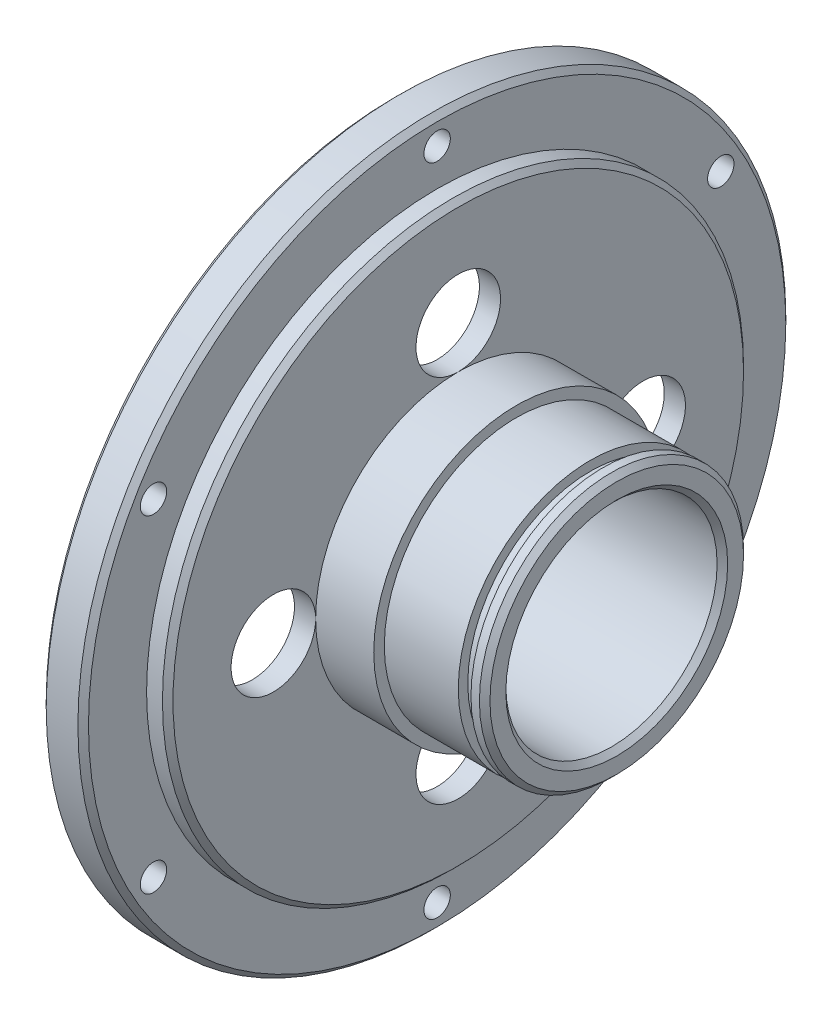
ISO-10303-21;
HEADER;
FILE_DESCRIPTION(('STEP AP214'),'2;1');
FILE_NAME('part.step','',(''),(''),'','','');
FILE_SCHEMA(('AUTOMOTIVE_DESIGN { 1 0 10303 214 1 1 1 1 }'));
ENDSEC;
DATA;
#1=APPLICATION_CONTEXT('core data for automotive mechanical design processes');
#2=APPLICATION_PROTOCOL_DEFINITION('international standard','automotive_design',2000,#1);
#3=PRODUCT_CONTEXT('',#1,'mechanical');
#4=PRODUCT('Part','Part','',(#3));
#5=PRODUCT_RELATED_PRODUCT_CATEGORY('part','',(#4));
#6=PRODUCT_DEFINITION_FORMATION('','',#4);
#7=PRODUCT_DEFINITION_CONTEXT('part definition',#1,'design');
#8=PRODUCT_DEFINITION('design','',#6,#7);
#9=PRODUCT_DEFINITION_SHAPE('','',#8);
#10=(LENGTH_UNIT() NAMED_UNIT(*) SI_UNIT(.MILLI.,.METRE.));
#11=(NAMED_UNIT(*) PLANE_ANGLE_UNIT() SI_UNIT($,.RADIAN.));
#12=(NAMED_UNIT(*) SI_UNIT($,.STERADIAN.) SOLID_ANGLE_UNIT());
#13=UNCERTAINTY_MEASURE_WITH_UNIT(LENGTH_MEASURE(1.E-05),#10,'distance_accuracy_value','');
#14=(GEOMETRIC_REPRESENTATION_CONTEXT(3) GLOBAL_UNCERTAINTY_ASSIGNED_CONTEXT((#13)) GLOBAL_UNIT_ASSIGNED_CONTEXT((#10,
#11,#12)) REPRESENTATION_CONTEXT('',''));
#15=CARTESIAN_POINT('',(0.,0.,0.));
#16=DIRECTION('',(0.,0.,1.));
#17=DIRECTION('',(1.,0.,0.));
#18=AXIS2_PLACEMENT_3D('',#15,#16,#17);
#19=CARTESIAN_POINT('',(0.,0.,0.));
#20=DIRECTION('',(-1.,0.,0.));
#21=DIRECTION('',(0.,0.,1.));
#22=AXIS2_PLACEMENT_3D('',#19,#20,#21);
#23=PLANE('',#22);
#24=CARTESIAN_POINT('',(0.,15.5000000000003,26.8467875173174));
#25=DIRECTION('',(1.,0.,0.));
#26=DIRECTION('',(0.,0.,-1.));
#27=AXIS2_PLACEMENT_3D('',#24,#25,#26);
#28=CIRCLE('',#27,1.25);
#29=CARTESIAN_POINT('',(0.,15.5000000000003,25.5967875173174));
#30=VERTEX_POINT('',#29);
#31=EDGE_CURVE('E261',#30,#30,#28,.T.);
#32=ORIENTED_EDGE('',*,*,#31,.T.);
#33=EDGE_LOOP('',(#32));
#34=FACE_BOUND('',#33,.T.);
#35=CARTESIAN_POINT('',(0.,0.,0.));
#36=DIRECTION('',(-1.,0.,0.));
#37=DIRECTION('',(0.,0.,1.));
#38=AXIS2_PLACEMENT_3D('',#35,#36,#37);
#39=CIRCLE('',#38,33.);
#40=CARTESIAN_POINT('',(0.,0.,33.));
#41=VERTEX_POINT('',#40);
#42=EDGE_CURVE('E177',#41,#41,#39,.T.);
#43=ORIENTED_EDGE('',*,*,#42,.T.);
#44=EDGE_LOOP('',(#43));
#45=FACE_BOUND('',#44,.T.);
#46=CARTESIAN_POINT('',(0.,0.,0.));
#47=DIRECTION('',(-1.,0.,0.));
#48=DIRECTION('',(0.,0.,1.));
#49=AXIS2_PLACEMENT_3D('',#46,#47,#48);
#50=CIRCLE('',#49,26.000000000003);
#51=CARTESIAN_POINT('',(0.,0.,26.000000000003));
#52=VERTEX_POINT('',#51);
#53=EDGE_CURVE('E181',#52,#52,#50,.F.);
#54=ORIENTED_EDGE('',*,*,#53,.T.);
#55=EDGE_LOOP('',(#54));
#56=FACE_BOUND('',#55,.T.);
#57=CARTESIAN_POINT('',(0.,31.,0.));
#58=DIRECTION('',(1.,0.,0.));
#59=DIRECTION('',(0.,0.,-1.));
#60=AXIS2_PLACEMENT_3D('',#57,#58,#59);
#61=CIRCLE('',#60,1.25);
#62=CARTESIAN_POINT('',(0.,31.,-1.25));
#63=VERTEX_POINT('',#62);
#64=EDGE_CURVE('E207',#63,#63,#61,.T.);
#65=ORIENTED_EDGE('',*,*,#64,.T.);
#66=EDGE_LOOP('',(#65));
#67=FACE_BOUND('',#66,.T.);
#68=CARTESIAN_POINT('',(0.,15.4999999999999,-26.8467875173176));
#69=DIRECTION('',(1.,0.,0.));
#70=DIRECTION('',(0.,0.,-1.));
#71=AXIS2_PLACEMENT_3D('',#68,#69,#70);
#72=CIRCLE('',#71,1.25);
#73=CARTESIAN_POINT('',(0.,15.4999999999999,-28.0967875173176));
#74=VERTEX_POINT('',#73);
#75=EDGE_CURVE('E229',#74,#74,#72,.T.);
#76=ORIENTED_EDGE('',*,*,#75,.T.);
#77=EDGE_LOOP('',(#76));
#78=FACE_BOUND('',#77,.T.);
#79=CARTESIAN_POINT('',(0.,-15.5000000000001,-26.8467875173175));
#80=DIRECTION('',(1.,0.,0.));
#81=DIRECTION('',(0.,0.,-1.));
#82=AXIS2_PLACEMENT_3D('',#79,#80,#81);
#83=CIRCLE('',#82,1.25);
#84=CARTESIAN_POINT('',(0.,-15.5000000000001,-28.0967875173175));
#85=VERTEX_POINT('',#84);
#86=EDGE_CURVE('E237',#85,#85,#83,.T.);
#87=ORIENTED_EDGE('',*,*,#86,.T.);
#88=EDGE_LOOP('',(#87));
#89=FACE_BOUND('',#88,.T.);
#90=CARTESIAN_POINT('',(0.,-31.,0.));
#91=DIRECTION('',(1.,0.,0.));
#92=DIRECTION('',(0.,0.,-1.));
#93=AXIS2_PLACEMENT_3D('',#90,#91,#92);
#94=CIRCLE('',#93,1.25);
#95=CARTESIAN_POINT('',(0.,-31.,-1.25));
#96=VERTEX_POINT('',#95);
#97=EDGE_CURVE('E245',#96,#96,#94,.T.);
#98=ORIENTED_EDGE('',*,*,#97,.T.);
#99=EDGE_LOOP('',(#98));
#100=FACE_BOUND('',#99,.T.);
#101=CARTESIAN_POINT('',(0.,-15.4999999999997,26.8467875173177));
#102=DIRECTION('',(1.,0.,0.));
#103=DIRECTION('',(0.,0.,-1.));
#104=AXIS2_PLACEMENT_3D('',#101,#102,#103);
#105=CIRCLE('',#104,1.25);
#106=CARTESIAN_POINT('',(0.,-15.4999999999997,25.5967875173177));
#107=VERTEX_POINT('',#106);
#108=EDGE_CURVE('E253',#107,#107,#105,.T.);
#109=ORIENTED_EDGE('',*,*,#108,.T.);
#110=EDGE_LOOP('',(#109));
#111=FACE_BOUND('',#110,.T.);
#112=ADVANCED_FACE('F53',(#34,#45,#56,#67,#78,#89,#100,#111),#23,.T.);
#113=CARTESIAN_POINT('',(0.,0.,0.));
#114=DIRECTION('',(-1.,0.,0.));
#115=DIRECTION('',(0.,0.,1.));
#116=AXIS2_PLACEMENT_3D('',#113,#114,#115);
#117=CYLINDRICAL_SURFACE('',#116,12.5);
#118=CARTESIAN_POINT('',(20.5,0.,0.));
#119=DIRECTION('',(1.,0.,0.));
#120=DIRECTION('',(0.,0.,-1.));
#121=AXIS2_PLACEMENT_3D('',#118,#119,#120);
#122=CIRCLE('',#121,12.5);
#123=CARTESIAN_POINT('',(20.5,0.,-12.5));
#124=VERTEX_POINT('',#123);
#125=EDGE_CURVE('E185',#124,#124,#122,.F.);
#126=ORIENTED_EDGE('',*,*,#125,.T.);
#127=EDGE_LOOP('',(#126));
#128=FACE_BOUND('',#127,.T.);
#129=CARTESIAN_POINT('',(19.7,0.,0.));
#130=DIRECTION('',(-1.,0.,0.));
#131=DIRECTION('',(0.,0.,1.));
#132=AXIS2_PLACEMENT_3D('',#129,#130,#131);
#133=CIRCLE('',#132,12.5);
#134=CARTESIAN_POINT('',(19.7,0.,12.5));
#135=VERTEX_POINT('',#134);
#136=EDGE_CURVE('E149',#135,#135,#133,.T.);
#137=ORIENTED_EDGE('',*,*,#136,.F.);
#138=EDGE_LOOP('',(#137));
#139=FACE_BOUND('',#138,.T.);
#140=ADVANCED_FACE('F305',(#128,#139),#117,.T.);
#141=CARTESIAN_POINT('',(19.7,0.,0.));
#142=DIRECTION('',(1.,0.,0.));
#143=DIRECTION('',(0.,0.,-1.));
#144=AXIS2_PLACEMENT_3D('',#141,#142,#143);
#145=PLANE('',#144);
#146=CARTESIAN_POINT('',(19.7,0.,0.));
#147=DIRECTION('',(-1.,0.,0.));
#148=DIRECTION('',(0.,0.,1.));
#149=AXIS2_PLACEMENT_3D('',#146,#147,#148);
#150=CIRCLE('',#149,11.6);
#151=CARTESIAN_POINT('',(19.7,0.,11.6));
#152=VERTEX_POINT('',#151);
#153=EDGE_CURVE('E145',#152,#152,#150,.T.);
#154=ORIENTED_EDGE('',*,*,#153,.F.);
#155=EDGE_LOOP('',(#154));
#156=FACE_BOUND('',#155,.T.);
#157=ORIENTED_EDGE('',*,*,#136,.T.);
#158=EDGE_LOOP('',(#157));
#159=FACE_BOUND('',#158,.T.);
#160=ADVANCED_FACE('F311',(#156,#159),#145,.F.);
#161=CARTESIAN_POINT('',(0.,0.,0.));
#162=DIRECTION('',(-1.,0.,0.));
#163=DIRECTION('',(0.,0.,1.));
#164=AXIS2_PLACEMENT_3D('',#161,#162,#163);
#165=CYLINDRICAL_SURFACE('',#164,11.6);
#166=ORIENTED_EDGE('',*,*,#153,.T.);
#167=EDGE_LOOP('',(#166));
#168=FACE_BOUND('',#167,.T.);
#169=CARTESIAN_POINT('',(18.5,0.,0.));
#170=DIRECTION('',(-1.,0.,0.));
#171=DIRECTION('',(0.,0.,1.));
#172=AXIS2_PLACEMENT_3D('',#169,#170,#171);
#173=CIRCLE('',#172,11.6);
#174=CARTESIAN_POINT('',(18.5,0.,11.6));
#175=VERTEX_POINT('',#174);
#176=EDGE_CURVE('E141',#175,#175,#173,.T.);
#177=ORIENTED_EDGE('',*,*,#176,.F.);
#178=EDGE_LOOP('',(#177));
#179=FACE_BOUND('',#178,.T.);
#180=ADVANCED_FACE('F385',(#168,#179),#165,.T.);
#181=CARTESIAN_POINT('',(18.5,0.,0.));
#182=DIRECTION('',(1.,0.,0.));
#183=DIRECTION('',(0.,0.,-1.));
#184=AXIS2_PLACEMENT_3D('',#181,#182,#183);
#185=PLANE('',#184);
#186=ORIENTED_EDGE('',*,*,#176,.T.);
#187=EDGE_LOOP('',(#186));
#188=FACE_BOUND('',#187,.T.);
#189=CARTESIAN_POINT('',(18.5,0.,0.));
#190=DIRECTION('',(-1.,0.,0.));
#191=DIRECTION('',(0.,0.,1.));
#192=AXIS2_PLACEMENT_3D('',#189,#190,#191);
#193=CIRCLE('',#192,12.5);
#194=CARTESIAN_POINT('',(18.5,0.,12.5));
#195=VERTEX_POINT('',#194);
#196=EDGE_CURVE('E137',#195,#195,#193,.T.);
#197=ORIENTED_EDGE('',*,*,#196,.F.);
#198=EDGE_LOOP('',(#197));
#199=FACE_BOUND('',#198,.T.);
#200=ADVANCED_FACE('F389',(#188,#199),#185,.T.);
#201=ORIENTED_EDGE('',*,*,#196,.T.);
#202=EDGE_LOOP('',(#201));
#203=FACE_BOUND('',#202,.T.);
#204=CARTESIAN_POINT('',(11.5,0.,0.));
#205=DIRECTION('',(-1.,0.,0.));
#206=DIRECTION('',(0.,0.,1.));
#207=AXIS2_PLACEMENT_3D('',#204,#205,#206);
#208=CIRCLE('',#207,12.5);
#209=CARTESIAN_POINT('',(11.5,0.,12.5));
#210=VERTEX_POINT('',#209);
#211=EDGE_CURVE('E133',#210,#210,#208,.T.);
#212=ORIENTED_EDGE('',*,*,#211,.F.);
#213=EDGE_LOOP('',(#212));
#214=FACE_BOUND('',#213,.T.);
#215=ADVANCED_FACE('F314',(#203,#214),#117,.T.);
#216=CARTESIAN_POINT('',(11.5,0.,0.));
#217=DIRECTION('',(1.,0.,0.));
#218=DIRECTION('',(0.,0.,-1.));
#219=AXIS2_PLACEMENT_3D('',#216,#217,#218);
#220=PLANE('',#219);
#221=ORIENTED_EDGE('',*,*,#211,.T.);
#222=EDGE_LOOP('',(#221));
#223=FACE_BOUND('',#222,.T.);
#224=CARTESIAN_POINT('',(11.5,0.,0.));
#225=DIRECTION('',(-1.,0.,0.));
#226=DIRECTION('',(0.,0.,1.));
#227=AXIS2_PLACEMENT_3D('',#224,#225,#226);
#228=CIRCLE('',#227,13.5);
#229=CARTESIAN_POINT('',(11.5,0.,13.5));
#230=VERTEX_POINT('',#229);
#231=EDGE_CURVE('E128',#230,#230,#228,.T.);
#232=ORIENTED_EDGE('',*,*,#231,.F.);
#233=EDGE_LOOP('',(#232));
#234=FACE_BOUND('',#233,.T.);
#235=ADVANCED_FACE('F395',(#223,#234),#220,.T.);
#236=CARTESIAN_POINT('',(0.,0.,0.));
#237=DIRECTION('',(-1.,0.,0.));
#238=DIRECTION('',(0.,0.,1.));
#239=AXIS2_PLACEMENT_3D('',#236,#237,#238);
#240=CYLINDRICAL_SURFACE('',#239,13.5);
#241=ORIENTED_EDGE('',*,*,#231,.T.);
#242=EDGE_LOOP('',(#241));
#243=FACE_BOUND('',#242,.T.);
#244=CARTESIAN_POINT('',(6.,0.,0.));
#245=DIRECTION('',(-1.,0.,0.));
#246=DIRECTION('',(0.,0.,1.));
#247=AXIS2_PLACEMENT_3D('',#244,#245,#246);
#248=CIRCLE('',#247,13.5);
#249=CARTESIAN_POINT('',(6.,0.,13.5));
#250=VERTEX_POINT('',#249);
#251=CARTESIAN_POINT('',(6.,13.5,0.));
#252=VERTEX_POINT('',#251);
#253=EDGE_CURVE('E84',#250,#252,#248,.T.);
#254=ORIENTED_EDGE('',*,*,#253,.F.);
#255=CARTESIAN_POINT('',(6.,-13.5,0.));
#256=VERTEX_POINT('',#255);
#257=EDGE_CURVE('E94',#256,#250,#248,.T.);
#258=ORIENTED_EDGE('',*,*,#257,.F.);
#259=CARTESIAN_POINT('',(6.,1.41404994223147E-13,-13.5));
#260=VERTEX_POINT('',#259);
#261=EDGE_CURVE('E129',#260,#256,#248,.T.);
#262=ORIENTED_EDGE('',*,*,#261,.F.);
#263=EDGE_CURVE('E97',#252,#260,#248,.T.);
#264=ORIENTED_EDGE('',*,*,#263,.F.);
#265=EDGE_LOOP('',(#254,#258,#262,#264));
#266=FACE_BOUND('',#265,.T.);
#267=ADVANCED_FACE('F301',(#243,#266),#240,.T.);
#268=CARTESIAN_POINT('',(6.,0.,0.));
#269=DIRECTION('',(1.,0.,0.));
#270=DIRECTION('',(0.,0.,-1.));
#271=AXIS2_PLACEMENT_3D('',#268,#269,#270);
#272=PLANE('',#271);
#273=CARTESIAN_POINT('',(6.,0.,0.));
#274=DIRECTION('',(1.,0.,0.));
#275=DIRECTION('',(0.,0.,-1.));
#276=AXIS2_PLACEMENT_3D('',#273,#274,#275);
#277=CIRCLE('',#276,27.);
#278=CARTESIAN_POINT('',(6.,0.,-27.));
#279=VERTEX_POINT('',#278);
#280=EDGE_CURVE('E193',#279,#279,#277,.T.);
#281=ORIENTED_EDGE('',*,*,#280,.T.);
#282=EDGE_LOOP('',(#281));
#283=FACE_BOUND('',#282,.T.);
#284=ORIENTED_EDGE('',*,*,#257,.T.);
#285=CARTESIAN_POINT('',(6.,0.,17.5));
#286=DIRECTION('',(1.,0.,0.));
#287=DIRECTION('',(0.,0.,-1.));
#288=AXIS2_PLACEMENT_3D('',#285,#286,#287);
#289=CIRCLE('',#288,4.);
#290=EDGE_CURVE('E70',#250,#250,#289,.T.);
#291=ORIENTED_EDGE('',*,*,#290,.F.);
#292=ORIENTED_EDGE('',*,*,#253,.T.);
#293=CARTESIAN_POINT('',(6.,17.5,0.));
#294=DIRECTION('',(1.,0.,0.));
#295=DIRECTION('',(0.,0.,-1.));
#296=AXIS2_PLACEMENT_3D('',#293,#294,#295);
#297=CIRCLE('',#296,4.);
#298=EDGE_CURVE('E89',#252,#252,#297,.T.);
#299=ORIENTED_EDGE('',*,*,#298,.F.);
#300=ORIENTED_EDGE('',*,*,#263,.T.);
#301=CARTESIAN_POINT('',(6.,1.83302770289265E-13,-17.5));
#302=DIRECTION('',(1.,0.,0.));
#303=DIRECTION('',(0.,0.,-1.));
#304=AXIS2_PLACEMENT_3D('',#301,#302,#303);
#305=CIRCLE('',#304,4.);
#306=EDGE_CURVE('E206',#260,#260,#305,.T.);
#307=ORIENTED_EDGE('',*,*,#306,.F.);
#308=ORIENTED_EDGE('',*,*,#261,.T.);
#309=CARTESIAN_POINT('',(6.,-17.5,0.));
#310=DIRECTION('',(1.,0.,0.));
#311=DIRECTION('',(0.,0.,-1.));
#312=AXIS2_PLACEMENT_3D('',#309,#310,#311);
#313=CIRCLE('',#312,4.);
#314=EDGE_CURVE('E75',#256,#256,#313,.T.);
#315=ORIENTED_EDGE('',*,*,#314,.F.);
#316=EDGE_LOOP('',(#284,#291,#292,#299,#300,#307,#308,#315));
#317=FACE_BOUND('',#316,.T.);
#318=ADVANCED_FACE('F87',(#283,#317),#272,.T.);
#319=CARTESIAN_POINT('',(0.,0.,0.));
#320=DIRECTION('',(-1.,0.,0.));
#321=DIRECTION('',(0.,0.,1.));
#322=AXIS2_PLACEMENT_3D('',#319,#320,#321);
#323=CYLINDRICAL_SURFACE('',#322,27.5);
#324=CARTESIAN_POINT('',(5.5,0.,0.));
#325=DIRECTION('',(1.,0.,0.));
#326=DIRECTION('',(0.,0.,-1.));
#327=AXIS2_PLACEMENT_3D('',#324,#325,#326);
#328=CIRCLE('',#327,27.5);
#329=CARTESIAN_POINT('',(5.5,0.,-27.5));
#330=VERTEX_POINT('',#329);
#331=EDGE_CURVE('E189',#330,#330,#328,.F.);
#332=ORIENTED_EDGE('',*,*,#331,.T.);
#333=EDGE_LOOP('',(#332));
#334=FACE_BOUND('',#333,.T.);
#335=CARTESIAN_POINT('',(4.,0.,0.));
#336=DIRECTION('',(-1.,0.,0.));
#337=DIRECTION('',(0.,0.,1.));
#338=AXIS2_PLACEMENT_3D('',#335,#336,#337);
#339=CIRCLE('',#338,27.5);
#340=CARTESIAN_POINT('',(4.,0.,27.5));
#341=VERTEX_POINT('',#340);
#342=EDGE_CURVE('E95',#341,#341,#339,.T.);
#343=ORIENTED_EDGE('',*,*,#342,.F.);
#344=EDGE_LOOP('',(#343));
#345=FACE_BOUND('',#344,.T.);
#346=ADVANCED_FACE('F277',(#334,#345),#323,.T.);
#347=CARTESIAN_POINT('',(4.,0.,0.));
#348=DIRECTION('',(1.,0.,0.));
#349=DIRECTION('',(0.,0.,-1.));
#350=AXIS2_PLACEMENT_3D('',#347,#348,#349);
#351=PLANE('',#350);
#352=CARTESIAN_POINT('',(4.,15.5000000000003,26.8467875173174));
#353=DIRECTION('',(1.,0.,0.));
#354=DIRECTION('',(0.,0.,-1.));
#355=AXIS2_PLACEMENT_3D('',#352,#353,#354);
#356=CIRCLE('',#355,1.25);
#357=CARTESIAN_POINT('',(4.,15.5000000000003,25.5967875173174));
#358=VERTEX_POINT('',#357);
#359=EDGE_CURVE('E265',#358,#358,#356,.T.);
#360=ORIENTED_EDGE('',*,*,#359,.F.);
#361=EDGE_LOOP('',(#360));
#362=FACE_BOUND('',#361,.T.);
#363=CARTESIAN_POINT('',(4.,-15.4999999999997,26.8467875173177));
#364=DIRECTION('',(1.,0.,0.));
#365=DIRECTION('',(0.,0.,-1.));
#366=AXIS2_PLACEMENT_3D('',#363,#364,#365);
#367=CIRCLE('',#366,1.25);
#368=CARTESIAN_POINT('',(4.,-15.4999999999997,25.5967875173177));
#369=VERTEX_POINT('',#368);
#370=EDGE_CURVE('E257',#369,#369,#367,.T.);
#371=ORIENTED_EDGE('',*,*,#370,.F.);
#372=EDGE_LOOP('',(#371));
#373=FACE_BOUND('',#372,.T.);
#374=CARTESIAN_POINT('',(4.,-31.,0.));
#375=DIRECTION('',(1.,0.,0.));
#376=DIRECTION('',(0.,0.,-1.));
#377=AXIS2_PLACEMENT_3D('',#374,#375,#376);
#378=CIRCLE('',#377,1.25);
#379=CARTESIAN_POINT('',(4.,-31.,-1.25));
#380=VERTEX_POINT('',#379);
#381=EDGE_CURVE('E249',#380,#380,#378,.T.);
#382=ORIENTED_EDGE('',*,*,#381,.F.);
#383=EDGE_LOOP('',(#382));
#384=FACE_BOUND('',#383,.T.);
#385=CARTESIAN_POINT('',(4.,-15.5000000000001,-26.8467875173175));
#386=DIRECTION('',(1.,0.,0.));
#387=DIRECTION('',(0.,0.,-1.));
#388=AXIS2_PLACEMENT_3D('',#385,#386,#387);
#389=CIRCLE('',#388,1.25);
#390=CARTESIAN_POINT('',(4.,-15.5000000000001,-28.0967875173175));
#391=VERTEX_POINT('',#390);
#392=EDGE_CURVE('E241',#391,#391,#389,.T.);
#393=ORIENTED_EDGE('',*,*,#392,.F.);
#394=EDGE_LOOP('',(#393));
#395=FACE_BOUND('',#394,.T.);
#396=CARTESIAN_POINT('',(4.,15.4999999999999,-26.8467875173176));
#397=DIRECTION('',(1.,0.,0.));
#398=DIRECTION('',(0.,0.,-1.));
#399=AXIS2_PLACEMENT_3D('',#396,#397,#398);
#400=CIRCLE('',#399,1.25);
#401=CARTESIAN_POINT('',(4.,15.4999999999999,-28.0967875173176));
#402=VERTEX_POINT('',#401);
#403=EDGE_CURVE('E233',#402,#402,#400,.T.);
#404=ORIENTED_EDGE('',*,*,#403,.F.);
#405=EDGE_LOOP('',(#404));
#406=FACE_BOUND('',#405,.T.);
#407=CARTESIAN_POINT('',(4.,31.,0.));
#408=DIRECTION('',(1.,0.,0.));
#409=DIRECTION('',(0.,0.,-1.));
#410=AXIS2_PLACEMENT_3D('',#407,#408,#409);
#411=CIRCLE('',#410,1.25);
#412=CARTESIAN_POINT('',(4.,31.,-1.25));
#413=VERTEX_POINT('',#412);
#414=EDGE_CURVE('E225',#413,#413,#411,.T.);
#415=ORIENTED_EDGE('',*,*,#414,.F.);
#416=EDGE_LOOP('',(#415));
#417=FACE_BOUND('',#416,.T.);
#418=CARTESIAN_POINT('',(4.,0.,0.));
#419=DIRECTION('',(1.,0.,0.));
#420=DIRECTION('',(0.,0.,-1.));
#421=AXIS2_PLACEMENT_3D('',#418,#419,#420);
#422=CIRCLE('',#421,33.);
#423=CARTESIAN_POINT('',(4.,0.,-33.));
#424=VERTEX_POINT('',#423);
#425=EDGE_CURVE('E11',#424,#424,#422,.T.);
#426=ORIENTED_EDGE('',*,*,#425,.T.);
#427=EDGE_LOOP('',(#426));
#428=FACE_BOUND('',#427,.T.);
#429=ORIENTED_EDGE('',*,*,#342,.T.);
#430=EDGE_LOOP('',(#429));
#431=FACE_BOUND('',#430,.T.);
#432=ADVANCED_FACE('F273',(#362,#373,#384,#395,#406,#417,#428,#431),#351,.T.);
#433=CARTESIAN_POINT('',(0.,0.,0.));
#434=DIRECTION('',(-1.,0.,0.));
#435=DIRECTION('',(0.,0.,1.));
#436=AXIS2_PLACEMENT_3D('',#433,#434,#435);
#437=CYLINDRICAL_SURFACE('',#436,33.5);
#438=CARTESIAN_POINT('',(0.49999999999998,0.,0.));
#439=DIRECTION('',(-1.,0.,0.));
#440=DIRECTION('',(0.,0.,1.));
#441=AXIS2_PLACEMENT_3D('',#438,#439,#440);
#442=CIRCLE('',#441,33.5);
#443=CARTESIAN_POINT('',(0.49999999999998,0.,33.5));
#444=VERTEX_POINT('',#443);
#445=EDGE_CURVE('E64',#444,#444,#442,.F.);
#446=ORIENTED_EDGE('',*,*,#445,.T.);
#447=EDGE_LOOP('',(#446));
#448=FACE_BOUND('',#447,.T.);
#449=CARTESIAN_POINT('',(3.50000000000001,0.,0.));
#450=DIRECTION('',(1.,0.,0.));
#451=DIRECTION('',(0.,0.,-1.));
#452=AXIS2_PLACEMENT_3D('',#449,#450,#451);
#453=CIRCLE('',#452,33.5);
#454=CARTESIAN_POINT('',(3.50000000000001,0.,-33.5));
#455=VERTEX_POINT('',#454);
#456=EDGE_CURVE('E197',#455,#455,#453,.F.);
#457=ORIENTED_EDGE('',*,*,#456,.T.);
#458=EDGE_LOOP('',(#457));
#459=FACE_BOUND('',#458,.T.);
#460=ADVANCED_FACE('F276',(#448,#459),#437,.T.);
#461=CARTESIAN_POINT('',(0.,0.,0.));
#462=DIRECTION('',(-1.,0.,0.));
#463=DIRECTION('',(0.,0.,1.));
#464=AXIS2_PLACEMENT_3D('',#461,#462,#463);
#465=CYLINDRICAL_SURFACE('',#464,25.5000000000015);
#466=CARTESIAN_POINT('',(3.49999999999855,0.,0.));
#467=DIRECTION('',(-1.,0.,0.));
#468=DIRECTION('',(0.,0.,1.));
#469=AXIS2_PLACEMENT_3D('',#466,#467,#468);
#470=CIRCLE('',#469,25.5000000000015);
#471=CARTESIAN_POINT('',(3.49999999999855,0.,25.5000000000015));
#472=VERTEX_POINT('',#471);
#473=EDGE_CURVE('E173',#472,#472,#470,.F.);
#474=ORIENTED_EDGE('',*,*,#473,.T.);
#475=EDGE_LOOP('',(#474));
#476=FACE_BOUND('',#475,.T.);
#477=CARTESIAN_POINT('',(0.500000000001475,0.,0.));
#478=DIRECTION('',(-1.,0.,0.));
#479=DIRECTION('',(0.,0.,1.));
#480=AXIS2_PLACEMENT_3D('',#477,#478,#479);
#481=CIRCLE('',#480,25.5000000000015);
#482=CARTESIAN_POINT('',(0.500000000001475,0.,25.5000000000015));
#483=VERTEX_POINT('',#482);
#484=EDGE_CURVE('E169',#483,#483,#481,.T.);
#485=ORIENTED_EDGE('',*,*,#484,.T.);
#486=EDGE_LOOP('',(#485));
#487=FACE_BOUND('',#486,.T.);
#488=ADVANCED_FACE('F318',(#476,#487),#465,.F.);
#489=CARTESIAN_POINT('',(4.,0.,0.));
#490=DIRECTION('',(-1.,0.,0.));
#491=DIRECTION('',(0.,0.,1.));
#492=AXIS2_PLACEMENT_3D('',#489,#490,#491);
#493=PLANE('',#492);
#494=CARTESIAN_POINT('',(4.,0.,17.5));
#495=DIRECTION('',(-1.,0.,0.));
#496=DIRECTION('',(0.,0.,1.));
#497=AXIS2_PLACEMENT_3D('',#494,#495,#496);
#498=CIRCLE('',#497,4.);
#499=CARTESIAN_POINT('',(4.,0.,21.5));
#500=VERTEX_POINT('',#499);
#501=EDGE_CURVE('E58',#500,#500,#498,.T.);
#502=ORIENTED_EDGE('',*,*,#501,.F.);
#503=EDGE_LOOP('',(#502));
#504=FACE_BOUND('',#503,.T.);
#505=CARTESIAN_POINT('',(4.,-17.5,0.));
#506=DIRECTION('',(-1.,0.,0.));
#507=DIRECTION('',(0.,0.,1.));
#508=AXIS2_PLACEMENT_3D('',#505,#506,#507);
#509=CIRCLE('',#508,4.);
#510=CARTESIAN_POINT('',(4.,-17.5,4.));
#511=VERTEX_POINT('',#510);
#512=EDGE_CURVE('E208',#511,#511,#509,.T.);
#513=ORIENTED_EDGE('',*,*,#512,.F.);
#514=EDGE_LOOP('',(#513));
#515=FACE_BOUND('',#514,.T.);
#516=CARTESIAN_POINT('',(4.,1.83302770289265E-13,-17.5));
#517=DIRECTION('',(-1.,0.,0.));
#518=DIRECTION('',(0.,0.,1.));
#519=AXIS2_PLACEMENT_3D('',#516,#517,#518);
#520=CIRCLE('',#519,4.);
#521=CARTESIAN_POINT('',(4.,1.83302770289265E-13,-13.5));
#522=VERTEX_POINT('',#521);
#523=EDGE_CURVE('E203',#522,#522,#520,.T.);
#524=ORIENTED_EDGE('',*,*,#523,.F.);
#525=EDGE_LOOP('',(#524));
#526=FACE_BOUND('',#525,.T.);
#527=CARTESIAN_POINT('',(4.,17.5,0.));
#528=DIRECTION('',(-1.,0.,0.));
#529=DIRECTION('',(0.,0.,1.));
#530=AXIS2_PLACEMENT_3D('',#527,#528,#529);
#531=CIRCLE('',#530,4.);
#532=CARTESIAN_POINT('',(4.,17.5,4.));
#533=VERTEX_POINT('',#532);
#534=EDGE_CURVE('E103',#533,#533,#531,.T.);
#535=ORIENTED_EDGE('',*,*,#534,.F.);
#536=EDGE_LOOP('',(#535));
#537=FACE_BOUND('',#536,.T.);
#538=CARTESIAN_POINT('',(4.,0.,0.));
#539=DIRECTION('',(-1.,0.,0.));
#540=DIRECTION('',(0.,0.,1.));
#541=AXIS2_PLACEMENT_3D('',#538,#539,#540);
#542=CIRCLE('',#541,25.);
#543=CARTESIAN_POINT('',(4.,0.,25.));
#544=VERTEX_POINT('',#543);
#545=EDGE_CURVE('E165',#544,#544,#542,.T.);
#546=ORIENTED_EDGE('',*,*,#545,.T.);
#547=EDGE_LOOP('',(#546));
#548=FACE_BOUND('',#547,.T.);
#549=CARTESIAN_POINT('',(4.,0.,0.));
#550=DIRECTION('',(-1.,0.,0.));
#551=DIRECTION('',(0.,0.,1.));
#552=AXIS2_PLACEMENT_3D('',#549,#550,#551);
#553=CIRCLE('',#552,9.);
#554=CARTESIAN_POINT('',(4.,0.,9.));
#555=VERTEX_POINT('',#554);
#556=EDGE_CURVE('E120',#555,#555,#553,.T.);
#557=ORIENTED_EDGE('',*,*,#556,.F.);
#558=EDGE_LOOP('',(#557));
#559=FACE_BOUND('',#558,.T.);
#560=ADVANCED_FACE('F324',(#504,#515,#526,#537,#548,#559),#493,.T.);
#561=CARTESIAN_POINT('',(0.,0.,0.));
#562=DIRECTION('',(-1.,0.,0.));
#563=DIRECTION('',(0.,0.,1.));
#564=AXIS2_PLACEMENT_3D('',#561,#562,#563);
#565=CYLINDRICAL_SURFACE('',#564,9.);
#566=ORIENTED_EDGE('',*,*,#556,.T.);
#567=EDGE_LOOP('',(#566));
#568=FACE_BOUND('',#567,.T.);
#569=CARTESIAN_POINT('',(6.,0.,0.));
#570=DIRECTION('',(-1.,0.,0.));
#571=DIRECTION('',(0.,0.,1.));
#572=AXIS2_PLACEMENT_3D('',#569,#570,#571);
#573=CIRCLE('',#572,9.);
#574=CARTESIAN_POINT('',(6.,0.,9.));
#575=VERTEX_POINT('',#574);
#576=EDGE_CURVE('E110',#575,#575,#573,.T.);
#577=ORIENTED_EDGE('',*,*,#576,.F.);
#578=EDGE_LOOP('',(#577));
#579=FACE_BOUND('',#578,.T.);
#580=ADVANCED_FACE('F420',(#568,#579),#565,.F.);
#581=CARTESIAN_POINT('',(6.,0.,0.));
#582=DIRECTION('',(1.,0.,0.));
#583=DIRECTION('',(0.,0.,-1.));
#584=AXIS2_PLACEMENT_3D('',#581,#582,#583);
#585=PLANE('',#584);
#586=ORIENTED_EDGE('',*,*,#576,.T.);
#587=EDGE_LOOP('',(#586));
#588=FACE_BOUND('',#587,.T.);
#589=CARTESIAN_POINT('',(6.00000000000001,0.,0.));
#590=DIRECTION('',(-1.,0.,0.));
#591=DIRECTION('',(0.,0.,1.));
#592=AXIS2_PLACEMENT_3D('',#589,#590,#591);
#593=CIRCLE('',#592,10.);
#594=CARTESIAN_POINT('',(6.00000000000001,0.,10.));
#595=VERTEX_POINT('',#594);
#596=EDGE_CURVE('E102',#595,#595,#593,.T.);
#597=ORIENTED_EDGE('',*,*,#596,.F.);
#598=EDGE_LOOP('',(#597));
#599=FACE_BOUND('',#598,.T.);
#600=ADVANCED_FACE('F602',(#588,#599),#585,.T.);
#601=CARTESIAN_POINT('',(0.,0.,0.));
#602=DIRECTION('',(-1.,0.,0.));
#603=DIRECTION('',(0.,0.,1.));
#604=AXIS2_PLACEMENT_3D('',#601,#602,#603);
#605=CYLINDRICAL_SURFACE('',#604,10.);
#606=CARTESIAN_POINT('',(20.5,0.,0.));
#607=DIRECTION('',(1.,0.,0.));
#608=DIRECTION('',(0.,0.,-1.));
#609=AXIS2_PLACEMENT_3D('',#606,#607,#608);
#610=CIRCLE('',#609,10.);
#611=CARTESIAN_POINT('',(20.5,0.,-10.));
#612=VERTEX_POINT('',#611);
#613=EDGE_CURVE('E161',#612,#612,#610,.T.);
#614=ORIENTED_EDGE('',*,*,#613,.T.);
#615=EDGE_LOOP('',(#614));
#616=FACE_BOUND('',#615,.T.);
#617=ORIENTED_EDGE('',*,*,#596,.T.);
#618=EDGE_LOOP('',(#617));
#619=FACE_BOUND('',#618,.T.);
#620=ADVANCED_FACE('F593',(#616,#619),#605,.F.);
#621=CARTESIAN_POINT('',(21.,0.,0.));
#622=DIRECTION('',(1.,0.,0.));
#623=DIRECTION('',(0.,0.,-1.));
#624=AXIS2_PLACEMENT_3D('',#621,#622,#623);
#625=PLANE('',#624);
#626=CARTESIAN_POINT('',(21.,0.,0.));
#627=DIRECTION('',(1.,0.,0.));
#628=DIRECTION('',(0.,0.,-1.));
#629=AXIS2_PLACEMENT_3D('',#626,#627,#628);
#630=CIRCLE('',#629,10.5);
#631=CARTESIAN_POINT('',(21.,0.,-10.5));
#632=VERTEX_POINT('',#631);
#633=EDGE_CURVE('E157',#632,#632,#630,.F.);
#634=ORIENTED_EDGE('',*,*,#633,.T.);
#635=EDGE_LOOP('',(#634));
#636=FACE_BOUND('',#635,.T.);
#637=CARTESIAN_POINT('',(21.,0.,0.));
#638=DIRECTION('',(1.,0.,0.));
#639=DIRECTION('',(0.,0.,-1.));
#640=AXIS2_PLACEMENT_3D('',#637,#638,#639);
#641=CIRCLE('',#640,12.);
#642=CARTESIAN_POINT('',(21.,0.,-12.));
#643=VERTEX_POINT('',#642);
#644=EDGE_CURVE('E153',#643,#643,#641,.T.);
#645=ORIENTED_EDGE('',*,*,#644,.T.);
#646=EDGE_LOOP('',(#645));
#647=FACE_BOUND('',#646,.T.);
#648=ADVANCED_FACE('F381',(#636,#647),#625,.T.);
#649=CARTESIAN_POINT('',(21.,0.,0.));
#650=DIRECTION('',(1.,0.,0.));
#651=DIRECTION('',(0.,0.,-1.));
#652=AXIS2_PLACEMENT_3D('',#649,#650,#651);
#653=CONICAL_SURFACE('',#652,10.5,0.785398163397448);
#654=ORIENTED_EDGE('',*,*,#613,.F.);
#655=EDGE_LOOP('',(#654));
#656=FACE_BOUND('',#655,.T.);
#657=ORIENTED_EDGE('',*,*,#633,.F.);
#658=EDGE_LOOP('',(#657));
#659=FACE_BOUND('',#658,.T.);
#660=ADVANCED_FACE('F375',(#656,#659),#653,.F.);
#661=CARTESIAN_POINT('',(4.,0.,0.));
#662=DIRECTION('',(-1.,0.,0.));
#663=DIRECTION('',(0.,0.,1.));
#664=AXIS2_PLACEMENT_3D('',#661,#662,#663);
#665=CONICAL_SURFACE('',#664,25.,0.785398163397441);
#666=ORIENTED_EDGE('',*,*,#473,.F.);
#667=EDGE_LOOP('',(#666));
#668=FACE_BOUND('',#667,.T.);
#669=ORIENTED_EDGE('',*,*,#545,.F.);
#670=EDGE_LOOP('',(#669));
#671=FACE_BOUND('',#670,.T.);
#672=ADVANCED_FACE('F368',(#668,#671),#665,.F.);
#673=CARTESIAN_POINT('',(0.500000000001475,0.,0.));
#674=DIRECTION('',(-1.,0.,0.));
#675=DIRECTION('',(0.,0.,1.));
#676=AXIS2_PLACEMENT_3D('',#673,#674,#675);
#677=CONICAL_SURFACE('',#676,25.5000000000015,0.785398163397452);
#678=ORIENTED_EDGE('',*,*,#53,.F.);
#679=EDGE_LOOP('',(#678));
#680=FACE_BOUND('',#679,.T.);
#681=ORIENTED_EDGE('',*,*,#484,.F.);
#682=EDGE_LOOP('',(#681));
#683=FACE_BOUND('',#682,.T.);
#684=ADVANCED_FACE('F361',(#680,#683),#677,.F.);
#685=CARTESIAN_POINT('',(20.5,0.,0.));
#686=DIRECTION('',(-1.,0.,0.));
#687=DIRECTION('',(0.,0.,1.));
#688=AXIS2_PLACEMENT_3D('',#685,#686,#687);
#689=CONICAL_SURFACE('',#688,12.5,0.785398163397454);
#690=ORIENTED_EDGE('',*,*,#644,.F.);
#691=EDGE_LOOP('',(#690));
#692=FACE_BOUND('',#691,.T.);
#693=ORIENTED_EDGE('',*,*,#125,.F.);
#694=EDGE_LOOP('',(#693));
#695=FACE_BOUND('',#694,.T.);
#696=ADVANCED_FACE('F344',(#692,#695),#689,.T.);
#697=CARTESIAN_POINT('',(5.5,0.,0.));
#698=DIRECTION('',(-1.,0.,0.));
#699=DIRECTION('',(0.,0.,1.));
#700=AXIS2_PLACEMENT_3D('',#697,#698,#699);
#701=CONICAL_SURFACE('',#700,27.5,0.785398163397452);
#702=ORIENTED_EDGE('',*,*,#280,.F.);
#703=EDGE_LOOP('',(#702));
#704=FACE_BOUND('',#703,.T.);
#705=ORIENTED_EDGE('',*,*,#331,.F.);
#706=EDGE_LOOP('',(#705));
#707=FACE_BOUND('',#706,.T.);
#708=ADVANCED_FACE('F339',(#704,#707),#701,.T.);
#709=CARTESIAN_POINT('',(0.,0.,0.));
#710=DIRECTION('',(1.,0.,0.));
#711=DIRECTION('',(0.,0.,-1.));
#712=AXIS2_PLACEMENT_3D('',#709,#710,#711);
#713=CONICAL_SURFACE('',#712,33.,0.785398163397455);
#714=ORIENTED_EDGE('',*,*,#445,.F.);
#715=EDGE_LOOP('',(#714));
#716=FACE_BOUND('',#715,.T.);
#717=ORIENTED_EDGE('',*,*,#42,.F.);
#718=EDGE_LOOP('',(#717));
#719=FACE_BOUND('',#718,.T.);
#720=ADVANCED_FACE('F331',(#716,#719),#713,.T.);
#721=CARTESIAN_POINT('',(3.50000000000001,0.,0.));
#722=DIRECTION('',(-1.,0.,0.));
#723=DIRECTION('',(0.,0.,1.));
#724=AXIS2_PLACEMENT_3D('',#721,#722,#723);
#725=CONICAL_SURFACE('',#724,33.5,0.785398163397448);
#726=ORIENTED_EDGE('',*,*,#425,.F.);
#727=EDGE_LOOP('',(#726));
#728=FACE_BOUND('',#727,.T.);
#729=ORIENTED_EDGE('',*,*,#456,.F.);
#730=EDGE_LOOP('',(#729));
#731=FACE_BOUND('',#730,.T.);
#732=ADVANCED_FACE('F56',(#728,#731),#725,.T.);
#733=CARTESIAN_POINT('',(0.,17.5,0.));
#734=DIRECTION('',(1.,0.,0.));
#735=DIRECTION('',(0.,0.,-1.));
#736=AXIS2_PLACEMENT_3D('',#733,#734,#735);
#737=CYLINDRICAL_SURFACE('',#736,4.);
#738=ORIENTED_EDGE('',*,*,#298,.T.);
#739=EDGE_LOOP('',(#738));
#740=FACE_BOUND('',#739,.T.);
#741=ORIENTED_EDGE('',*,*,#534,.T.);
#742=EDGE_LOOP('',(#741));
#743=FACE_BOUND('',#742,.T.);
#744=ADVANCED_FACE('F99',(#740,#743),#737,.F.);
#745=CARTESIAN_POINT('',(0.,1.83302770289265E-13,-17.5));
#746=DIRECTION('',(1.,0.,0.));
#747=DIRECTION('',(0.,0.,-1.));
#748=AXIS2_PLACEMENT_3D('',#745,#746,#747);
#749=CYLINDRICAL_SURFACE('',#748,4.);
#750=ORIENTED_EDGE('',*,*,#306,.T.);
#751=EDGE_LOOP('',(#750));
#752=FACE_BOUND('',#751,.T.);
#753=ORIENTED_EDGE('',*,*,#523,.T.);
#754=EDGE_LOOP('',(#753));
#755=FACE_BOUND('',#754,.T.);
#756=ADVANCED_FACE('F337',(#752,#755),#749,.F.);
#757=CARTESIAN_POINT('',(0.,-17.5,0.));
#758=DIRECTION('',(1.,0.,0.));
#759=DIRECTION('',(0.,0.,-1.));
#760=AXIS2_PLACEMENT_3D('',#757,#758,#759);
#761=CYLINDRICAL_SURFACE('',#760,4.);
#762=ORIENTED_EDGE('',*,*,#314,.T.);
#763=EDGE_LOOP('',(#762));
#764=FACE_BOUND('',#763,.T.);
#765=ORIENTED_EDGE('',*,*,#512,.T.);
#766=EDGE_LOOP('',(#765));
#767=FACE_BOUND('',#766,.T.);
#768=ADVANCED_FACE('F430',(#764,#767),#761,.F.);
#769=CARTESIAN_POINT('',(0.,0.,17.5));
#770=DIRECTION('',(1.,0.,0.));
#771=DIRECTION('',(0.,0.,-1.));
#772=AXIS2_PLACEMENT_3D('',#769,#770,#771);
#773=CYLINDRICAL_SURFACE('',#772,4.);
#774=ORIENTED_EDGE('',*,*,#290,.T.);
#775=EDGE_LOOP('',(#774));
#776=FACE_BOUND('',#775,.T.);
#777=ORIENTED_EDGE('',*,*,#501,.T.);
#778=EDGE_LOOP('',(#777));
#779=FACE_BOUND('',#778,.T.);
#780=ADVANCED_FACE('F439',(#776,#779),#773,.F.);
#781=CARTESIAN_POINT('',(4.,31.,0.));
#782=DIRECTION('',(1.,0.,0.));
#783=DIRECTION('',(0.,0.,-1.));
#784=AXIS2_PLACEMENT_3D('',#781,#782,#783);
#785=CYLINDRICAL_SURFACE('',#784,1.25);
#786=ORIENTED_EDGE('',*,*,#64,.F.);
#787=EDGE_LOOP('',(#786));
#788=FACE_BOUND('',#787,.T.);
#789=ORIENTED_EDGE('',*,*,#414,.T.);
#790=EDGE_LOOP('',(#789));
#791=FACE_BOUND('',#790,.T.);
#792=ADVANCED_FACE('F446',(#788,#791),#785,.F.);
#793=CARTESIAN_POINT('',(4.,15.4999999999999,-26.8467875173176));
#794=DIRECTION('',(1.,0.,0.));
#795=DIRECTION('',(0.,0.,-1.));
#796=AXIS2_PLACEMENT_3D('',#793,#794,#795);
#797=CYLINDRICAL_SURFACE('',#796,1.25);
#798=ORIENTED_EDGE('',*,*,#75,.F.);
#799=EDGE_LOOP('',(#798));
#800=FACE_BOUND('',#799,.T.);
#801=ORIENTED_EDGE('',*,*,#403,.T.);
#802=EDGE_LOOP('',(#801));
#803=FACE_BOUND('',#802,.T.);
#804=ADVANCED_FACE('F455',(#800,#803),#797,.F.);
#805=CARTESIAN_POINT('',(4.,-15.5000000000001,-26.8467875173175));
#806=DIRECTION('',(1.,0.,0.));
#807=DIRECTION('',(0.,0.,-1.));
#808=AXIS2_PLACEMENT_3D('',#805,#806,#807);
#809=CYLINDRICAL_SURFACE('',#808,1.25);
#810=ORIENTED_EDGE('',*,*,#86,.F.);
#811=EDGE_LOOP('',(#810));
#812=FACE_BOUND('',#811,.T.);
#813=ORIENTED_EDGE('',*,*,#392,.T.);
#814=EDGE_LOOP('',(#813));
#815=FACE_BOUND('',#814,.T.);
#816=ADVANCED_FACE('F474',(#812,#815),#809,.F.);
#817=CARTESIAN_POINT('',(4.,-31.,0.));
#818=DIRECTION('',(1.,0.,0.));
#819=DIRECTION('',(0.,0.,-1.));
#820=AXIS2_PLACEMENT_3D('',#817,#818,#819);
#821=CYLINDRICAL_SURFACE('',#820,1.25);
#822=ORIENTED_EDGE('',*,*,#97,.F.);
#823=EDGE_LOOP('',(#822));
#824=FACE_BOUND('',#823,.T.);
#825=ORIENTED_EDGE('',*,*,#381,.T.);
#826=EDGE_LOOP('',(#825));
#827=FACE_BOUND('',#826,.T.);
#828=ADVANCED_FACE('F467',(#824,#827),#821,.F.);
#829=CARTESIAN_POINT('',(4.,-15.4999999999997,26.8467875173177));
#830=DIRECTION('',(1.,0.,0.));
#831=DIRECTION('',(0.,0.,-1.));
#832=AXIS2_PLACEMENT_3D('',#829,#830,#831);
#833=CYLINDRICAL_SURFACE('',#832,1.25);
#834=ORIENTED_EDGE('',*,*,#108,.F.);
#835=EDGE_LOOP('',(#834));
#836=FACE_BOUND('',#835,.T.);
#837=ORIENTED_EDGE('',*,*,#370,.T.);
#838=EDGE_LOOP('',(#837));
#839=FACE_BOUND('',#838,.T.);
#840=ADVANCED_FACE('F473',(#836,#839),#833,.F.);
#841=CARTESIAN_POINT('',(4.,15.5000000000003,26.8467875173174));
#842=DIRECTION('',(1.,0.,0.));
#843=DIRECTION('',(0.,0.,-1.));
#844=AXIS2_PLACEMENT_3D('',#841,#842,#843);
#845=CYLINDRICAL_SURFACE('',#844,1.25);
#846=ORIENTED_EDGE('',*,*,#31,.F.);
#847=EDGE_LOOP('',(#846));
#848=FACE_BOUND('',#847,.T.);
#849=ORIENTED_EDGE('',*,*,#359,.T.);
#850=EDGE_LOOP('',(#849));
#851=FACE_BOUND('',#850,.T.);
#852=ADVANCED_FACE('F271',(#848,#851),#845,.F.);
#853=CLOSED_SHELL('',(#112,#140,#160,#180,#200,#215,#235,#267,#318,#346,#432,#460,#488,#560,
#580,#600,#620,#648,#660,#672,#684,#696,#708,#720,#732,#744,#756,#768,#780,#792,#804,#816,#828,
#840,#852));
#854=MANIFOLD_SOLID_BREP('B2',#853);
#855=ADVANCED_BREP_SHAPE_REPRESENTATION('',(#18,#854),#14);
#856=SHAPE_DEFINITION_REPRESENTATION(#9,#855);
ENDSEC;
END-ISO-10303-21;
